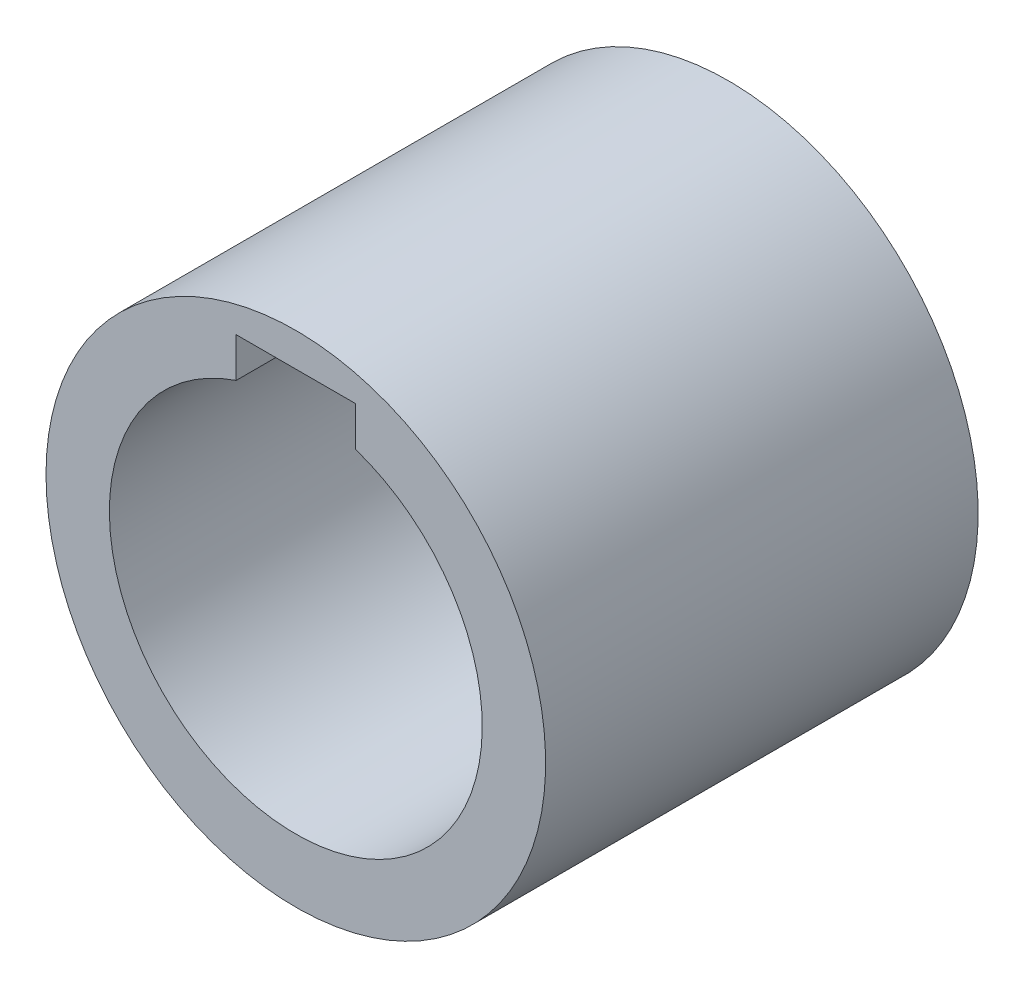
ISO-10303-21;
HEADER;
FILE_DESCRIPTION(('STEP AP214'),'2;1');
FILE_NAME('part.step','',(''),(''),'','','');
FILE_SCHEMA(('AUTOMOTIVE_DESIGN { 1 0 10303 214 1 1 1 1 }'));
ENDSEC;
DATA;
#1=APPLICATION_CONTEXT('core data for automotive mechanical design processes');
#2=APPLICATION_PROTOCOL_DEFINITION('international standard','automotive_design',2000,#1);
#3=PRODUCT_CONTEXT('',#1,'mechanical');
#4=PRODUCT('Part','Part','',(#3));
#5=PRODUCT_RELATED_PRODUCT_CATEGORY('part','',(#4));
#6=PRODUCT_DEFINITION_FORMATION('','',#4);
#7=PRODUCT_DEFINITION_CONTEXT('part definition',#1,'design');
#8=PRODUCT_DEFINITION('design','',#6,#7);
#9=PRODUCT_DEFINITION_SHAPE('','',#8);
#10=(LENGTH_UNIT() NAMED_UNIT(*) SI_UNIT(.MILLI.,.METRE.));
#11=(NAMED_UNIT(*) PLANE_ANGLE_UNIT() SI_UNIT($,.RADIAN.));
#12=(NAMED_UNIT(*) SI_UNIT($,.STERADIAN.) SOLID_ANGLE_UNIT());
#13=UNCERTAINTY_MEASURE_WITH_UNIT(LENGTH_MEASURE(1.E-05),#10,'distance_accuracy_value','');
#14=(GEOMETRIC_REPRESENTATION_CONTEXT(3) GLOBAL_UNCERTAINTY_ASSIGNED_CONTEXT((#13)) GLOBAL_UNIT_ASSIGNED_CONTEXT((#10,
#11,#12)) REPRESENTATION_CONTEXT('',''));
#15=CARTESIAN_POINT('',(0.,0.,0.));
#16=DIRECTION('',(0.,0.,1.));
#17=DIRECTION('',(1.,0.,0.));
#18=AXIS2_PLACEMENT_3D('',#15,#16,#17);
#19=CARTESIAN_POINT('',(0.,0.,29.));
#20=DIRECTION('',(0.,0.,1.));
#21=DIRECTION('',(1.,0.,0.));
#22=AXIS2_PLACEMENT_3D('',#19,#20,#21);
#23=PLANE('',#22);
#24=DIRECTION('',(0.,1.,0.));
#25=VECTOR('',#24,1.);
#26=CARTESIAN_POINT('',(4.,14.5,29.));
#27=LINE('',#26,#25);
#28=CARTESIAN_POINT('',(4.,11.842719282327,29.));
#29=VERTEX_POINT('',#28);
#30=CARTESIAN_POINT('',(4.,14.5,29.));
#31=VERTEX_POINT('',#30);
#32=EDGE_CURVE('E113',#29,#31,#27,.T.);
#33=ORIENTED_EDGE('',*,*,#32,.F.);
#34=CARTESIAN_POINT('',(0.,0.,29.));
#35=DIRECTION('',(0.,0.,1.));
#36=DIRECTION('',(1.,0.,0.));
#37=AXIS2_PLACEMENT_3D('',#34,#35,#36);
#38=CIRCLE('',#37,12.5);
#39=CARTESIAN_POINT('',(-4.,11.842719282327,29.));
#40=VERTEX_POINT('',#39);
#41=EDGE_CURVE('E133',#40,#29,#38,.T.);
#42=ORIENTED_EDGE('',*,*,#41,.F.);
#43=DIRECTION('',(0.,-1.,0.));
#44=VECTOR('',#43,1.);
#45=CARTESIAN_POINT('',(-4.,14.5,29.));
#46=LINE('',#45,#44);
#47=CARTESIAN_POINT('',(-4.,14.5,29.));
#48=VERTEX_POINT('',#47);
#49=EDGE_CURVE('E123',#48,#40,#46,.T.);
#50=ORIENTED_EDGE('',*,*,#49,.F.);
#51=DIRECTION('',(-1.,0.,0.));
#52=VECTOR('',#51,1.);
#53=CARTESIAN_POINT('',(-4.,14.5,29.));
#54=LINE('',#53,#52);
#55=EDGE_CURVE('E102',#31,#48,#54,.T.);
#56=ORIENTED_EDGE('',*,*,#55,.F.);
#57=EDGE_LOOP('',(#33,#42,#50,#56));
#58=FACE_BOUND('',#57,.T.);
#59=CARTESIAN_POINT('',(0.,0.,29.));
#60=DIRECTION('',(0.,0.,1.));
#61=DIRECTION('',(1.,0.,0.));
#62=AXIS2_PLACEMENT_3D('',#59,#60,#61);
#63=CIRCLE('',#62,16.75);
#64=CARTESIAN_POINT('',(-16.75,0.,29.));
#65=VERTEX_POINT('',#64);
#66=EDGE_CURVE('E140',#65,#65,#63,.T.);
#67=ORIENTED_EDGE('',*,*,#66,.T.);
#68=EDGE_LOOP('',(#67));
#69=FACE_BOUND('',#68,.T.);
#70=ADVANCED_FACE('F39',(#58,#69),#23,.T.);
#71=CARTESIAN_POINT('',(0.,0.,0.));
#72=DIRECTION('',(0.,0.,1.));
#73=DIRECTION('',(1.,0.,0.));
#74=AXIS2_PLACEMENT_3D('',#71,#72,#73);
#75=PLANE('',#74);
#76=CARTESIAN_POINT('',(0.,0.,0.));
#77=DIRECTION('',(0.,0.,1.));
#78=DIRECTION('',(1.,0.,0.));
#79=AXIS2_PLACEMENT_3D('',#76,#77,#78);
#80=CIRCLE('',#79,16.75);
#81=CARTESIAN_POINT('',(-16.75,0.,0.));
#82=VERTEX_POINT('',#81);
#83=EDGE_CURVE('E136',#82,#82,#80,.T.);
#84=ORIENTED_EDGE('',*,*,#83,.F.);
#85=EDGE_LOOP('',(#84));
#86=FACE_BOUND('',#85,.T.);
#87=CARTESIAN_POINT('',(0.,0.,0.));
#88=DIRECTION('',(0.,0.,1.));
#89=DIRECTION('',(1.,0.,0.));
#90=AXIS2_PLACEMENT_3D('',#87,#88,#89);
#91=CIRCLE('',#90,12.5);
#92=CARTESIAN_POINT('',(12.5,0.,0.));
#93=VERTEX_POINT('',#92);
#94=EDGE_CURVE('E131',#93,#93,#91,.T.);
#95=ORIENTED_EDGE('',*,*,#94,.T.);
#96=EDGE_LOOP('',(#95));
#97=FACE_BOUND('',#96,.T.);
#98=ADVANCED_FACE('F186',(#86,#97),#75,.F.);
#99=CARTESIAN_POINT('',(0.,0.,29.));
#100=DIRECTION('',(0.,0.,-1.));
#101=DIRECTION('',(-1.,0.,0.));
#102=AXIS2_PLACEMENT_3D('',#99,#100,#101);
#103=CYLINDRICAL_SURFACE('',#102,16.75);
#104=CARTESIAN_POINT('',(-16.75,0.,29.));
#105=CARTESIAN_POINT('',(-16.75,0.,28.6979166666667));
#106=CARTESIAN_POINT('',(-16.75,0.,28.3958333333333));
#107=CARTESIAN_POINT('',(-16.75,0.,27.7916666666667));
#108=CARTESIAN_POINT('',(-16.75,0.,27.4895833333333));
#109=CARTESIAN_POINT('',(-16.75,0.,26.8854166666667));
#110=CARTESIAN_POINT('',(-16.75,0.,26.5833333333333));
#111=CARTESIAN_POINT('',(-16.75,0.,25.9791666666667));
#112=CARTESIAN_POINT('',(-16.75,0.,25.6770833333333));
#113=CARTESIAN_POINT('',(-16.75,0.,25.0729166666667));
#114=CARTESIAN_POINT('',(-16.75,0.,24.7708333333333));
#115=CARTESIAN_POINT('',(-16.75,0.,24.1666666666667));
#116=CARTESIAN_POINT('',(-16.75,0.,23.8645833333333));
#117=CARTESIAN_POINT('',(-16.75,0.,23.2604166666667));
#118=CARTESIAN_POINT('',(-16.75,0.,22.9583333333333));
#119=CARTESIAN_POINT('',(-16.75,0.,22.3541666666667));
#120=CARTESIAN_POINT('',(-16.75,0.,22.0520833333333));
#121=CARTESIAN_POINT('',(-16.75,0.,21.4479166666667));
#122=CARTESIAN_POINT('',(-16.75,0.,21.1458333333333));
#123=CARTESIAN_POINT('',(-16.75,0.,20.5416666666667));
#124=CARTESIAN_POINT('',(-16.75,0.,20.2395833333333));
#125=CARTESIAN_POINT('',(-16.75,0.,19.6354166666667));
#126=CARTESIAN_POINT('',(-16.75,0.,19.3333333333333));
#127=CARTESIAN_POINT('',(-16.75,0.,18.7291666666667));
#128=CARTESIAN_POINT('',(-16.75,0.,18.4270833333333));
#129=CARTESIAN_POINT('',(-16.75,0.,17.8229166666667));
#130=CARTESIAN_POINT('',(-16.75,0.,17.5208333333333));
#131=CARTESIAN_POINT('',(-16.75,0.,16.9166666666667));
#132=CARTESIAN_POINT('',(-16.75,0.,16.6145833333333));
#133=CARTESIAN_POINT('',(-16.75,0.,16.0104166666667));
#134=CARTESIAN_POINT('',(-16.75,0.,15.7083333333333));
#135=CARTESIAN_POINT('',(-16.75,0.,15.1041666666667));
#136=CARTESIAN_POINT('',(-16.75,0.,14.8020833333333));
#137=CARTESIAN_POINT('',(-16.75,0.,14.1979166666667));
#138=CARTESIAN_POINT('',(-16.75,0.,13.8958333333333));
#139=CARTESIAN_POINT('',(-16.75,0.,13.2916666666667));
#140=CARTESIAN_POINT('',(-16.75,0.,12.9895833333333));
#141=CARTESIAN_POINT('',(-16.75,0.,12.3854166666667));
#142=CARTESIAN_POINT('',(-16.75,0.,12.0833333333333));
#143=CARTESIAN_POINT('',(-16.75,0.,11.4791666666667));
#144=CARTESIAN_POINT('',(-16.75,0.,11.1770833333333));
#145=CARTESIAN_POINT('',(-16.75,0.,10.5729166666667));
#146=CARTESIAN_POINT('',(-16.75,0.,10.2708333333333));
#147=CARTESIAN_POINT('',(-16.75,0.,9.66666666666667));
#148=CARTESIAN_POINT('',(-16.75,0.,9.36458333333333));
#149=CARTESIAN_POINT('',(-16.75,0.,8.76041666666667));
#150=CARTESIAN_POINT('',(-16.75,0.,8.45833333333333));
#151=CARTESIAN_POINT('',(-16.75,0.,7.85416666666667));
#152=CARTESIAN_POINT('',(-16.75,0.,7.55208333333333));
#153=CARTESIAN_POINT('',(-16.75,0.,6.94791666666667));
#154=CARTESIAN_POINT('',(-16.75,0.,6.64583333333333));
#155=CARTESIAN_POINT('',(-16.75,0.,6.04166666666667));
#156=CARTESIAN_POINT('',(-16.75,0.,5.73958333333333));
#157=CARTESIAN_POINT('',(-16.75,0.,5.13541666666667));
#158=CARTESIAN_POINT('',(-16.75,0.,4.83333333333333));
#159=CARTESIAN_POINT('',(-16.75,0.,4.22916666666667));
#160=CARTESIAN_POINT('',(-16.75,0.,3.92708333333333));
#161=CARTESIAN_POINT('',(-16.75,0.,3.32291666666667));
#162=CARTESIAN_POINT('',(-16.75,0.,3.02083333333333));
#163=CARTESIAN_POINT('',(-16.75,0.,2.41666666666667));
#164=CARTESIAN_POINT('',(-16.75,0.,2.11458333333333));
#165=CARTESIAN_POINT('',(-16.75,0.,1.51041666666667));
#166=CARTESIAN_POINT('',(-16.75,0.,1.20833333333333));
#167=CARTESIAN_POINT('',(-16.75,0.,0.604166666666667));
#168=CARTESIAN_POINT('',(-16.75,0.,0.302083333333333));
#169=CARTESIAN_POINT('',(-16.75,0.,0.));
#170=B_SPLINE_CURVE_WITH_KNOTS('',3,(#104,#105,#106,#107,#108,#109,#110,#111,#112,#113,#114,
#115,#116,#117,#118,#119,#120,#121,#122,#123,#124,#125,#126,#127,#128,#129,#130,#131,#132,#133,
#134,#135,#136,#137,#138,#139,#140,#141,#142,#143,#144,#145,#146,#147,#148,#149,#150,#151,#152,
#153,#154,#155,#156,#157,#158,#159,#160,#161,#162,#163,#164,#165,#166,#167,#168,#169),
.UNSPECIFIED.,.F.,.F.,(4,2,2,2,2,2,2,2,2,2,2,2,2,2,2,2,2,2,2,2,2,2,2,2,2,2,2,2,2,2,2,2,4),(0.,
0.906250000000001,1.8125,2.71875,3.625,4.53125,5.4375,6.34375,7.25,8.15625,9.0625,9.96875,
10.875,11.78125,12.6875,13.59375,14.5,15.40625,16.3125,17.21875,18.125,19.03125,19.9375,
20.84375,21.75,22.65625,23.5625,24.46875,25.375,26.28125,27.1875,28.09375,29.),.UNSPECIFIED.);
#171=EDGE_CURVE('BSEAM181',#65,#82,#170,.T.);
#172=ORIENTED_EDGE('',*,*,#66,.F.);
#173=ORIENTED_EDGE('',*,*,#83,.T.);
#174=ORIENTED_EDGE('',*,*,#171,.T.);
#175=ORIENTED_EDGE('',*,*,#171,.F.);
#176=EDGE_LOOP('',(#172,#174,#173,#175));
#177=FACE_BOUND('',#176,.T.);
#178=ADVANCED_FACE('F181',(#177),#103,.T.);
#179=CARTESIAN_POINT('',(0.,0.,29.));
#180=DIRECTION('',(0.,0.,-1.));
#181=DIRECTION('',(-1.,0.,0.));
#182=AXIS2_PLACEMENT_3D('',#179,#180,#181);
#183=CYLINDRICAL_SURFACE('',#182,12.5);
#184=DIRECTION('',(0.,0.,-1.));
#185=VECTOR('',#184,1.);
#186=CARTESIAN_POINT('',(4.,11.842719282327,29.));
#187=LINE('',#186,#185);
#188=CARTESIAN_POINT('',(4.,11.842719282327,6.00000000000001));
#189=VERTEX_POINT('',#188);
#190=EDGE_CURVE('E116',#189,#29,#187,.F.);
#191=ORIENTED_EDGE('',*,*,#190,.F.);
#192=CARTESIAN_POINT('',(4.,11.842719282327,6.));
#193=CARTESIAN_POINT('',(4.00000873597288,11.8427117882509,5.93187916371077));
#194=CARTESIAN_POINT('',(3.99721589734432,11.8436595292481,5.86376359050083));
#195=CARTESIAN_POINT('',(3.98609475839764,11.8474094838376,5.72805150845794));
#196=CARTESIAN_POINT('',(3.97776765214065,11.8502112973988,5.66045489083797));
#197=CARTESIAN_POINT('',(3.95567477007805,11.8576036878013,5.52643632594061));
#198=CARTESIAN_POINT('',(3.94192338926952,11.8621895297299,5.46001175180712));
#199=CARTESIAN_POINT('',(3.90912185516305,11.873039320505,5.32864187462073));
#200=CARTESIAN_POINT('',(3.8900715802945,11.8793033078524,5.26369660554398));
#201=CARTESIAN_POINT('',(3.82521412714073,11.9004130304784,5.07179484838815));
#202=CARTESIAN_POINT('',(3.77167286626044,11.9175860791974,4.9476078382675));
#203=CARTESIAN_POINT('',(3.64573870572226,11.9567098381084,4.7100695879675));
#204=CARTESIAN_POINT('',(3.57333737602629,11.9786626840431,4.59672322437248));
#205=CARTESIAN_POINT('',(3.40932406875786,12.0263877092004,4.38029434198037));
#206=CARTESIAN_POINT('',(3.31720682087608,12.0522537183482,4.27761502247591));
#207=CARTESIAN_POINT('',(3.11758813894304,12.1054244367158,4.08890405818294));
#208=CARTESIAN_POINT('',(3.01008182349878,12.1327296006907,4.00287771614296));
#209=CARTESIAN_POINT('',(2.77795975216906,12.1880144998263,3.84659797637135));
#210=CARTESIAN_POINT('',(2.65284403083264,12.2159796351553,3.77708088103631));
#211=CARTESIAN_POINT('',(2.39223527798861,12.2696727938047,3.66028274795615));
#212=CARTESIAN_POINT('',(2.25674927538136,12.2954023075953,3.61298680139277));
#213=CARTESIAN_POINT('',(2.01740890001238,12.3365500943892,3.55192579915406));
#214=CARTESIAN_POINT('',(1.91511380354644,12.3528571024395,3.53251443325601));
#215=CARTESIAN_POINT('',(1.7086218433541,12.3831195270193,3.50654273089668));
#216=CARTESIAN_POINT('',(1.60442598605555,12.3970761501613,3.49997578202933));
#217=CARTESIAN_POINT('',(1.5,12.4096736459909,3.5));
#218=B_SPLINE_CURVE_WITH_KNOTS('',3,(#192,#193,#194,#195,#196,#197,#198,#199,#200,#201,#202,
#203,#204,#205,#206,#207,#208,#209,#210,#211,#212,#213,#214,#215,#216,#217),.UNSPECIFIED.,.F.,
.F.,(4,2,2,2,2,2,2,2,2,2,2,2,4),(0.,0.204289710859291,0.408535358932947,0.612242585553049,
0.815954486139898,1.22288324066387,1.62999419647236,2.04915755375086,2.46845416496509,
2.903922359504,3.33909796700181,3.65448018622705,3.96970000144713),.UNSPECIFIED.);
#219=CARTESIAN_POINT('',(1.5,12.4096736459909,3.5));
#220=VERTEX_POINT('',#219);
#221=EDGE_CURVE('E164',#189,#220,#218,.T.);
#222=ORIENTED_EDGE('',*,*,#221,.T.);
#223=CARTESIAN_POINT('',(0.,0.,3.5));
#224=DIRECTION('',(0.,0.,1.));
#225=DIRECTION('',(1.,0.,0.));
#226=AXIS2_PLACEMENT_3D('',#223,#224,#225);
#227=CIRCLE('',#226,12.5);
#228=CARTESIAN_POINT('',(-1.5,12.4096736459909,3.5));
#229=VERTEX_POINT('',#228);
#230=EDGE_CURVE('E144',#220,#229,#227,.T.);
#231=ORIENTED_EDGE('',*,*,#230,.T.);
#232=CARTESIAN_POINT('',(-1.5,12.4096736459909,3.5));
#233=CARTESIAN_POINT('',(-1.57100235678797,12.4010973052718,3.49999287441866));
#234=CARTESIAN_POINT('',(-1.64192228960628,12.3919008914312,3.50302463775882));
#235=CARTESIAN_POINT('',(-1.78308053072855,12.3723749045044,3.51507084620884));
#236=CARTESIAN_POINT('',(-1.85331897831739,12.3620455685162,3.52408404151064));
#237=CARTESIAN_POINT('',(-1.99250508745311,12.3403761201161,3.5479770705734));
#238=CARTESIAN_POINT('',(-2.06145480134035,12.3290378167882,3.56284656171373));
#239=CARTESIAN_POINT('',(-2.19769814468393,12.3054830062983,3.5982967697194));
#240=CARTESIAN_POINT('',(-2.26499172246256,12.2932664717786,3.61887766455679));
#241=CARTESIAN_POINT('',(-2.46366754631697,12.2555468850705,3.68893534064214));
#242=CARTESIAN_POINT('',(-2.59201015282426,12.2289477275276,3.74675581949287));
#243=CARTESIAN_POINT('',(-2.83696944222782,12.1744573761749,3.88288285083922));
#244=CARTESIAN_POINT('',(-2.95358256314199,12.146565793618,3.96119560053209));
#245=CARTESIAN_POINT('',(-3.17426618926996,12.0907912044088,4.13796234123793));
#246=CARTESIAN_POINT('',(-3.27805605289111,12.0629184443287,4.23677098209905));
#247=CARTESIAN_POINT('',(-3.4675624368076,12.0098178195209,4.45107833754211));
#248=CARTESIAN_POINT('',(-3.55327667423874,11.9845902890749,4.56657915716481));
#249=CARTESIAN_POINT('',(-3.70354253636559,11.9390084141234,4.81054248872449));
#250=CARTESIAN_POINT('',(-3.76821428409258,11.9186265939938,4.93892575065748));
#251=CARTESIAN_POINT('',(-3.87475135480522,11.8844210294389,5.20557695933961));
#252=CARTESIAN_POINT('',(-3.91664384744152,11.8705894748263,5.34383290680986));
#253=CARTESIAN_POINT('',(-3.96415283121098,11.8547811602189,5.5693733886198));
#254=CARTESIAN_POINT('',(-3.97757751713997,11.8502753616807,5.6549126846643));
#255=CARTESIAN_POINT('',(-3.99550353094203,11.8442383218746,5.82695135130282));
#256=CARTESIAN_POINT('',(-4.00001229978081,11.842704600219,5.9134498606785));
#257=CARTESIAN_POINT('',(-4.,11.842719282327,6.));
#258=B_SPLINE_CURVE_WITH_KNOTS('',3,(#232,#233,#234,#235,#236,#237,#238,#239,#240,#241,#242,
#243,#244,#245,#246,#247,#248,#249,#250,#251,#252,#253,#254,#255,#256,#257),.UNSPECIFIED.,.F.,
.F.,(4,2,2,2,2,2,2,2,2,2,2,2,4),(0.,0.214476406986887,0.428908013667642,0.642962605435677,
0.857023868071115,1.28464344058217,1.71239248198905,2.14827466556402,2.58421186602675,
3.01761493910302,3.45049993620463,3.71013768730242,3.96955866066241),.UNSPECIFIED.);
#259=CARTESIAN_POINT('',(-4.,11.842719282327,6.00000000000001));
#260=VERTEX_POINT('',#259);
#261=EDGE_CURVE('E11',#229,#260,#258,.T.);
#262=ORIENTED_EDGE('',*,*,#261,.T.);
#263=DIRECTION('',(0.,0.,-1.));
#264=VECTOR('',#263,1.);
#265=CARTESIAN_POINT('',(-4.,11.842719282327,29.));
#266=LINE('',#265,#264);
#267=EDGE_CURVE('E150',#40,#260,#266,.T.);
#268=ORIENTED_EDGE('',*,*,#267,.F.);
#269=ORIENTED_EDGE('',*,*,#41,.T.);
#270=EDGE_LOOP('',(#191,#222,#231,#262,#268,#269));
#271=FACE_BOUND('',#270,.T.);
#272=ORIENTED_EDGE('',*,*,#94,.F.);
#273=EDGE_LOOP('',(#272));
#274=FACE_BOUND('',#273,.T.);
#275=ADVANCED_FACE('F176',(#271,#274),#183,.F.);
#276=CARTESIAN_POINT('',(4.,14.5,3.5));
#277=DIRECTION('',(1.,0.,0.));
#278=DIRECTION('',(0.,0.,-1.));
#279=AXIS2_PLACEMENT_3D('',#276,#277,#278);
#280=PLANE('',#279);
#281=DIRECTION('',(0.,0.,1.));
#282=VECTOR('',#281,1.);
#283=CARTESIAN_POINT('',(4.,14.5,3.5));
#284=LINE('',#283,#282);
#285=CARTESIAN_POINT('',(4.,14.5,6.));
#286=VERTEX_POINT('',#285);
#287=EDGE_CURVE('E98',#286,#31,#284,.T.);
#288=ORIENTED_EDGE('',*,*,#287,.F.);
#289=DIRECTION('',(0.,1.,0.));
#290=VECTOR('',#289,1.);
#291=CARTESIAN_POINT('',(4.,14.5,6.));
#292=LINE('',#291,#290);
#293=EDGE_CURVE('E161',#286,#189,#292,.F.);
#294=ORIENTED_EDGE('',*,*,#293,.T.);
#295=ORIENTED_EDGE('',*,*,#190,.T.);
#296=ORIENTED_EDGE('',*,*,#32,.T.);
#297=EDGE_LOOP('',(#288,#294,#295,#296));
#298=FACE_BOUND('',#297,.T.);
#299=ADVANCED_FACE('F114',(#298),#280,.F.);
#300=CARTESIAN_POINT('',(-4.,14.5,3.5));
#301=DIRECTION('',(-1.,0.,0.));
#302=DIRECTION('',(0.,-1.,0.));
#303=AXIS2_PLACEMENT_3D('',#300,#301,#302);
#304=PLANE('',#303);
#305=ORIENTED_EDGE('',*,*,#267,.T.);
#306=DIRECTION('',(0.,-1.,0.));
#307=VECTOR('',#306,1.);
#308=CARTESIAN_POINT('',(-4.,14.5,6.));
#309=LINE('',#308,#307);
#310=CARTESIAN_POINT('',(-4.,14.5,6.));
#311=VERTEX_POINT('',#310);
#312=EDGE_CURVE('E61',#260,#311,#309,.F.);
#313=ORIENTED_EDGE('',*,*,#312,.T.);
#314=DIRECTION('',(0.,0.,1.));
#315=VECTOR('',#314,1.);
#316=CARTESIAN_POINT('',(-4.,14.5,3.5));
#317=LINE('',#316,#315);
#318=EDGE_CURVE('E109',#311,#48,#317,.T.);
#319=ORIENTED_EDGE('',*,*,#318,.T.);
#320=ORIENTED_EDGE('',*,*,#49,.T.);
#321=EDGE_LOOP('',(#305,#313,#319,#320));
#322=FACE_BOUND('',#321,.T.);
#323=ADVANCED_FACE('F214',(#322),#304,.F.);
#324=CARTESIAN_POINT('',(-4.,14.5,3.5));
#325=DIRECTION('',(0.,1.,0.));
#326=DIRECTION('',(0.,0.,1.));
#327=AXIS2_PLACEMENT_3D('',#324,#325,#326);
#328=PLANE('',#327);
#329=ORIENTED_EDGE('',*,*,#318,.F.);
#330=CARTESIAN_POINT('',(-1.5,14.5,6.));
#331=DIRECTION('',(0.,1.,0.));
#332=DIRECTION('',(0.,0.,1.));
#333=AXIS2_PLACEMENT_3D('',#330,#331,#332);
#334=CIRCLE('',#333,2.5);
#335=CARTESIAN_POINT('',(-1.5,14.5,3.5));
#336=VERTEX_POINT('',#335);
#337=EDGE_CURVE('E54',#311,#336,#334,.F.);
#338=ORIENTED_EDGE('',*,*,#337,.T.);
#339=DIRECTION('',(-1.,0.,0.));
#340=VECTOR('',#339,1.);
#341=CARTESIAN_POINT('',(-4.,14.5,3.5));
#342=LINE('',#341,#340);
#343=CARTESIAN_POINT('',(1.5,14.5,3.5));
#344=VERTEX_POINT('',#343);
#345=EDGE_CURVE('E110',#344,#336,#342,.T.);
#346=ORIENTED_EDGE('',*,*,#345,.F.);
#347=CARTESIAN_POINT('',(1.5,14.5,6.));
#348=DIRECTION('',(0.,1.,0.));
#349=DIRECTION('',(0.,0.,1.));
#350=AXIS2_PLACEMENT_3D('',#347,#348,#349);
#351=CIRCLE('',#350,2.5);
#352=EDGE_CURVE('E105',#344,#286,#351,.F.);
#353=ORIENTED_EDGE('',*,*,#352,.T.);
#354=ORIENTED_EDGE('',*,*,#287,.T.);
#355=ORIENTED_EDGE('',*,*,#55,.T.);
#356=EDGE_LOOP('',(#329,#338,#346,#353,#354,#355));
#357=FACE_BOUND('',#356,.T.);
#358=ADVANCED_FACE('F100',(#357),#328,.F.);
#359=CARTESIAN_POINT('',(0.,0.,3.5));
#360=DIRECTION('',(0.,0.,1.));
#361=DIRECTION('',(1.,0.,0.));
#362=AXIS2_PLACEMENT_3D('',#359,#360,#361);
#363=PLANE('',#362);
#364=ORIENTED_EDGE('',*,*,#345,.T.);
#365=DIRECTION('',(0.,-1.,0.));
#366=VECTOR('',#365,1.);
#367=CARTESIAN_POINT('',(-1.5,0.,3.5));
#368=LINE('',#367,#366);
#369=EDGE_CURVE('E171',#336,#229,#368,.T.);
#370=ORIENTED_EDGE('',*,*,#369,.T.);
#371=ORIENTED_EDGE('',*,*,#230,.F.);
#372=DIRECTION('',(0.,1.,0.));
#373=VECTOR('',#372,1.);
#374=CARTESIAN_POINT('',(1.5,0.,3.5));
#375=LINE('',#374,#373);
#376=EDGE_CURVE('E155',#220,#344,#375,.T.);
#377=ORIENTED_EDGE('',*,*,#376,.T.);
#378=EDGE_LOOP('',(#364,#370,#371,#377));
#379=FACE_BOUND('',#378,.T.);
#380=ADVANCED_FACE('F225',(#379),#363,.T.);
#381=CARTESIAN_POINT('',(1.5,0.,6.));
#382=DIRECTION('',(0.,1.,0.));
#383=DIRECTION('',(0.,0.,1.));
#384=AXIS2_PLACEMENT_3D('',#381,#382,#383);
#385=CYLINDRICAL_SURFACE('',#384,2.5);
#386=ORIENTED_EDGE('',*,*,#221,.F.);
#387=ORIENTED_EDGE('',*,*,#293,.F.);
#388=ORIENTED_EDGE('',*,*,#352,.F.);
#389=ORIENTED_EDGE('',*,*,#376,.F.);
#390=EDGE_LOOP('',(#386,#387,#388,#389));
#391=FACE_BOUND('',#390,.T.);
#392=ADVANCED_FACE('F173',(#391),#385,.F.);
#393=CARTESIAN_POINT('',(-1.5,0.,6.));
#394=DIRECTION('',(0.,-1.,0.));
#395=DIRECTION('',(1.,0.,0.));
#396=AXIS2_PLACEMENT_3D('',#393,#394,#395);
#397=CYLINDRICAL_SURFACE('',#396,2.5);
#398=ORIENTED_EDGE('',*,*,#337,.F.);
#399=ORIENTED_EDGE('',*,*,#312,.F.);
#400=ORIENTED_EDGE('',*,*,#261,.F.);
#401=ORIENTED_EDGE('',*,*,#369,.F.);
#402=EDGE_LOOP('',(#398,#399,#400,#401));
#403=FACE_BOUND('',#402,.T.);
#404=ADVANCED_FACE('F41',(#403),#397,.F.);
#405=CLOSED_SHELL('',(#70,#98,#178,#275,#299,#323,#358,#380,#392,#404));
#406=MANIFOLD_SOLID_BREP('B2',#405);
#407=ADVANCED_BREP_SHAPE_REPRESENTATION('',(#18,#406),#14);
#408=SHAPE_DEFINITION_REPRESENTATION(#9,#407);
ENDSEC;
END-ISO-10303-21;
